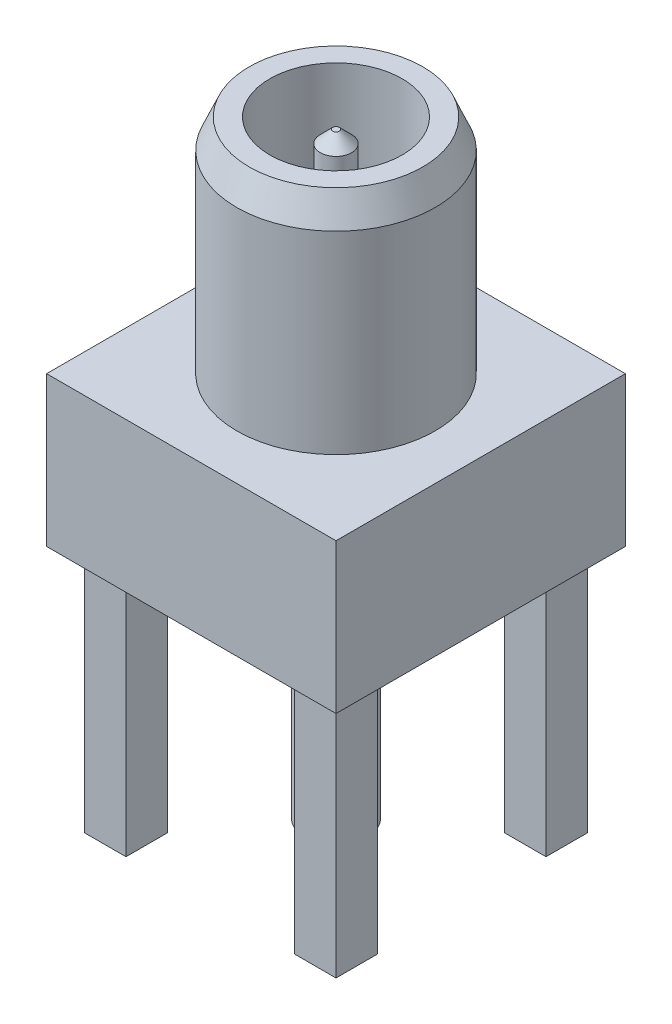
ISO-10303-21;
HEADER;
FILE_DESCRIPTION(('STEP AP214'),'2;1');
FILE_NAME('part.step','',(''),(''),'','','');
FILE_SCHEMA(('AUTOMOTIVE_DESIGN { 1 0 10303 214 1 1 1 1 }'));
ENDSEC;
DATA;
#1=APPLICATION_CONTEXT('core data for automotive mechanical design processes');
#2=APPLICATION_PROTOCOL_DEFINITION('international standard','automotive_design',2000,#1);
#3=PRODUCT_CONTEXT('',#1,'mechanical');
#4=PRODUCT('Part','Part','',(#3));
#5=PRODUCT_RELATED_PRODUCT_CATEGORY('part','',(#4));
#6=PRODUCT_DEFINITION_FORMATION('','',#4);
#7=PRODUCT_DEFINITION_CONTEXT('part definition',#1,'design');
#8=PRODUCT_DEFINITION('design','',#6,#7);
#9=PRODUCT_DEFINITION_SHAPE('','',#8);
#10=(LENGTH_UNIT() NAMED_UNIT(*) SI_UNIT(.MILLI.,.METRE.));
#11=(NAMED_UNIT(*) PLANE_ANGLE_UNIT() SI_UNIT($,.RADIAN.));
#12=(NAMED_UNIT(*) SI_UNIT($,.STERADIAN.) SOLID_ANGLE_UNIT());
#13=UNCERTAINTY_MEASURE_WITH_UNIT(LENGTH_MEASURE(1.E-05),#10,'distance_accuracy_value','');
#14=(GEOMETRIC_REPRESENTATION_CONTEXT(3) GLOBAL_UNCERTAINTY_ASSIGNED_CONTEXT((#13)) GLOBAL_UNIT_ASSIGNED_CONTEXT((#10,
#11,#12)) REPRESENTATION_CONTEXT('',''));
#15=CARTESIAN_POINT('',(0.,0.,0.));
#16=DIRECTION('',(0.,0.,1.));
#17=DIRECTION('',(1.,0.,0.));
#18=AXIS2_PLACEMENT_3D('',#15,#16,#17);
#19=CARTESIAN_POINT('',(0.,0.,0.));
#20=DIRECTION('',(0.,-1.,0.));
#21=DIRECTION('',(0.,0.,-1.));
#22=AXIS2_PLACEMENT_3D('',#19,#20,#21);
#23=PLANE('',#22);
#24=CARTESIAN_POINT('',(0.,0.,0.));
#25=DIRECTION('',(0.,-1.,0.));
#26=DIRECTION('',(0.,0.,1.));
#27=AXIS2_PLACEMENT_3D('',#24,#25,#26);
#28=CIRCLE('',#27,1.);
#29=CARTESIAN_POINT('',(0.,0.,1.));
#30=VERTEX_POINT('',#29);
#31=EDGE_CURVE('E529',#30,#30,#28,.T.);
#32=ORIENTED_EDGE('',*,*,#31,.F.);
#33=EDGE_LOOP('',(#32));
#34=FACE_BOUND('',#33,.T.);
#35=DIRECTION('',(-1.,0.,0.));
#36=VECTOR('',#35,1.);
#37=CARTESIAN_POINT('',(1.75,0.,1.75));
#38=LINE('',#37,#36);
#39=CARTESIAN_POINT('',(1.75,0.,1.75));
#40=VERTEX_POINT('',#39);
#41=CARTESIAN_POINT('',(-1.75,0.,1.75));
#42=VERTEX_POINT('',#41);
#43=EDGE_CURVE('E284',#40,#42,#38,.T.);
#44=ORIENTED_EDGE('',*,*,#43,.T.);
#45=DIRECTION('',(0.,0.,-1.));
#46=VECTOR('',#45,1.);
#47=CARTESIAN_POINT('',(-1.75,0.,1.75));
#48=LINE('',#47,#46);
#49=CARTESIAN_POINT('',(-1.75,0.,-1.75));
#50=VERTEX_POINT('',#49);
#51=EDGE_CURVE('E301',#42,#50,#48,.T.);
#52=ORIENTED_EDGE('',*,*,#51,.T.);
#53=DIRECTION('',(1.,0.,0.));
#54=VECTOR('',#53,1.);
#55=CARTESIAN_POINT('',(-1.75,0.,-1.75));
#56=LINE('',#55,#54);
#57=CARTESIAN_POINT('',(1.75,0.,-1.75));
#58=VERTEX_POINT('',#57);
#59=EDGE_CURVE('E304',#50,#58,#56,.T.);
#60=ORIENTED_EDGE('',*,*,#59,.T.);
#61=DIRECTION('',(0.,0.,1.));
#62=VECTOR('',#61,1.);
#63=CARTESIAN_POINT('',(1.75,0.,-1.75));
#64=LINE('',#63,#62);
#65=EDGE_CURVE('E289',#58,#40,#64,.T.);
#66=ORIENTED_EDGE('',*,*,#65,.T.);
#67=EDGE_LOOP('',(#44,#52,#60,#66));
#68=FACE_BOUND('',#67,.T.);
#69=DIRECTION('',(-1.,0.,0.));
#70=VECTOR('',#69,1.);
#71=CARTESIAN_POINT('',(-1.52,0.,-1.02000000000002));
#72=LINE('',#71,#70);
#73=CARTESIAN_POINT('',(-1.02,0.,-1.02000000000002));
#74=VERTEX_POINT('',#73);
#75=CARTESIAN_POINT('',(-1.52,0.,-1.02000000000002));
#76=VERTEX_POINT('',#75);
#77=EDGE_CURVE('E269',#74,#76,#72,.T.);
#78=ORIENTED_EDGE('',*,*,#77,.F.);
#79=DIRECTION('',(0.,0.,1.));
#80=VECTOR('',#79,1.);
#81=CARTESIAN_POINT('',(-1.02,0.,-1.02000000000002));
#82=LINE('',#81,#80);
#83=CARTESIAN_POINT('',(-1.02,0.,-1.52000000000002));
#84=VERTEX_POINT('',#83);
#85=EDGE_CURVE('E255',#84,#74,#82,.T.);
#86=ORIENTED_EDGE('',*,*,#85,.F.);
#87=DIRECTION('',(1.,0.,0.));
#88=VECTOR('',#87,1.);
#89=CARTESIAN_POINT('',(-1.02,0.,-1.52000000000002));
#90=LINE('',#89,#88);
#91=CARTESIAN_POINT('',(-1.52,0.,-1.52000000000002));
#92=VERTEX_POINT('',#91);
#93=EDGE_CURVE('E260',#92,#84,#90,.T.);
#94=ORIENTED_EDGE('',*,*,#93,.F.);
#95=DIRECTION('',(0.,0.,-1.));
#96=VECTOR('',#95,1.);
#97=CARTESIAN_POINT('',(-1.52,0.,-1.52000000000002));
#98=LINE('',#97,#96);
#99=EDGE_CURVE('E271',#76,#92,#98,.T.);
#100=ORIENTED_EDGE('',*,*,#99,.F.);
#101=EDGE_LOOP('',(#78,#86,#94,#100));
#102=FACE_BOUND('',#101,.T.);
#103=DIRECTION('',(0.,0.,-1.));
#104=VECTOR('',#103,1.);
#105=CARTESIAN_POINT('',(1.02,0.,-1.02000000000002));
#106=LINE('',#105,#104);
#107=CARTESIAN_POINT('',(1.02,0.,-1.02000000000002));
#108=VERTEX_POINT('',#107);
#109=CARTESIAN_POINT('',(1.02,0.,-1.52000000000002));
#110=VERTEX_POINT('',#109);
#111=EDGE_CURVE('E240',#108,#110,#106,.T.);
#112=ORIENTED_EDGE('',*,*,#111,.F.);
#113=DIRECTION('',(-1.,0.,0.));
#114=VECTOR('',#113,1.);
#115=CARTESIAN_POINT('',(1.52,0.,-1.02000000000002));
#116=LINE('',#115,#114);
#117=CARTESIAN_POINT('',(1.52,0.,-1.02000000000002));
#118=VERTEX_POINT('',#117);
#119=EDGE_CURVE('E226',#118,#108,#116,.T.);
#120=ORIENTED_EDGE('',*,*,#119,.F.);
#121=DIRECTION('',(0.,0.,1.));
#122=VECTOR('',#121,1.);
#123=CARTESIAN_POINT('',(1.52,0.,-1.52000000000002));
#124=LINE('',#123,#122);
#125=CARTESIAN_POINT('',(1.52,0.,-1.52000000000002));
#126=VERTEX_POINT('',#125);
#127=EDGE_CURVE('E231',#126,#118,#124,.T.);
#128=ORIENTED_EDGE('',*,*,#127,.F.);
#129=DIRECTION('',(1.,0.,0.));
#130=VECTOR('',#129,1.);
#131=CARTESIAN_POINT('',(1.02,0.,-1.52000000000002));
#132=LINE('',#131,#130);
#133=EDGE_CURVE('E242',#110,#126,#132,.T.);
#134=ORIENTED_EDGE('',*,*,#133,.F.);
#135=EDGE_LOOP('',(#112,#120,#128,#134));
#136=FACE_BOUND('',#135,.T.);
#137=DIRECTION('',(1.,0.,0.));
#138=VECTOR('',#137,1.);
#139=CARTESIAN_POINT('',(1.52,0.,1.02000000000002));
#140=LINE('',#139,#138);
#141=CARTESIAN_POINT('',(1.02,0.,1.02000000000002));
#142=VERTEX_POINT('',#141);
#143=CARTESIAN_POINT('',(1.52,0.,1.02000000000002));
#144=VERTEX_POINT('',#143);
#145=EDGE_CURVE('E198',#142,#144,#140,.T.);
#146=ORIENTED_EDGE('',*,*,#145,.F.);
#147=DIRECTION('',(0.,0.,-1.));
#148=VECTOR('',#147,1.);
#149=CARTESIAN_POINT('',(1.02,0.,1.02000000000002));
#150=LINE('',#149,#148);
#151=CARTESIAN_POINT('',(1.02,0.,1.52000000000002));
#152=VERTEX_POINT('',#151);
#153=EDGE_CURVE('E195',#152,#142,#150,.T.);
#154=ORIENTED_EDGE('',*,*,#153,.F.);
#155=DIRECTION('',(-1.,0.,0.));
#156=VECTOR('',#155,1.);
#157=CARTESIAN_POINT('',(1.02,0.,1.52000000000002));
#158=LINE('',#157,#156);
#159=CARTESIAN_POINT('',(1.52,0.,1.52000000000002));
#160=VERTEX_POINT('',#159);
#161=EDGE_CURVE('E207',#160,#152,#158,.T.);
#162=ORIENTED_EDGE('',*,*,#161,.F.);
#163=DIRECTION('',(0.,0.,1.));
#164=VECTOR('',#163,1.);
#165=CARTESIAN_POINT('',(1.52,0.,1.52000000000002));
#166=LINE('',#165,#164);
#167=EDGE_CURVE('E215',#144,#160,#166,.T.);
#168=ORIENTED_EDGE('',*,*,#167,.F.);
#169=EDGE_LOOP('',(#146,#154,#162,#168));
#170=FACE_BOUND('',#169,.T.);
#171=DIRECTION('',(0.,0.,1.));
#172=VECTOR('',#171,1.);
#173=CARTESIAN_POINT('',(-1.02,0.,1.02000000000002));
#174=LINE('',#173,#172);
#175=CARTESIAN_POINT('',(-1.02,0.,1.02000000000002));
#176=VERTEX_POINT('',#175);
#177=CARTESIAN_POINT('',(-1.02,0.,1.52000000000002));
#178=VERTEX_POINT('',#177);
#179=EDGE_CURVE('E516',#176,#178,#174,.T.);
#180=ORIENTED_EDGE('',*,*,#179,.F.);
#181=DIRECTION('',(1.,0.,0.));
#182=VECTOR('',#181,1.);
#183=CARTESIAN_POINT('',(-1.52,0.,1.02000000000002));
#184=LINE('',#183,#182);
#185=CARTESIAN_POINT('',(-1.52,0.,1.02000000000002));
#186=VERTEX_POINT('',#185);
#187=EDGE_CURVE('E193',#186,#176,#184,.T.);
#188=ORIENTED_EDGE('',*,*,#187,.F.);
#189=DIRECTION('',(0.,0.,-1.));
#190=VECTOR('',#189,1.);
#191=CARTESIAN_POINT('',(-1.52,0.,1.52000000000002));
#192=LINE('',#191,#190);
#193=CARTESIAN_POINT('',(-1.52,0.,1.52000000000002));
#194=VERTEX_POINT('',#193);
#195=EDGE_CURVE('E189',#194,#186,#192,.T.);
#196=ORIENTED_EDGE('',*,*,#195,.F.);
#197=DIRECTION('',(-1.,0.,0.));
#198=VECTOR('',#197,1.);
#199=CARTESIAN_POINT('',(-1.02,0.,1.52000000000002));
#200=LINE('',#199,#198);
#201=EDGE_CURVE('E518',#178,#194,#200,.T.);
#202=ORIENTED_EDGE('',*,*,#201,.F.);
#203=EDGE_LOOP('',(#180,#188,#196,#202));
#204=FACE_BOUND('',#203,.T.);
#205=ADVANCED_FACE('F32',(#34,#68,#102,#136,#170,#204),#23,.T.);
#206=CARTESIAN_POINT('',(1.75,1.81000000000001,1.75));
#207=DIRECTION('',(0.,0.,1.));
#208=DIRECTION('',(1.,0.,0.));
#209=AXIS2_PLACEMENT_3D('',#206,#207,#208);
#210=PLANE('',#209);
#211=ORIENTED_EDGE('',*,*,#43,.F.);
#212=DIRECTION('',(0.,-1.,0.));
#213=VECTOR('',#212,1.);
#214=CARTESIAN_POINT('',(1.75,1.81000000000001,1.75));
#215=LINE('',#214,#213);
#216=CARTESIAN_POINT('',(1.75,1.81000000000001,1.75));
#217=VERTEX_POINT('',#216);
#218=EDGE_CURVE('E309',#217,#40,#215,.T.);
#219=ORIENTED_EDGE('',*,*,#218,.F.);
#220=DIRECTION('',(-1.,0.,0.));
#221=VECTOR('',#220,1.);
#222=CARTESIAN_POINT('',(1.75,1.81000000000001,1.75));
#223=LINE('',#222,#221);
#224=CARTESIAN_POINT('',(-1.75,1.81000000000001,1.75));
#225=VERTEX_POINT('',#224);
#226=EDGE_CURVE('E285',#217,#225,#223,.T.);
#227=ORIENTED_EDGE('',*,*,#226,.T.);
#228=DIRECTION('',(0.,-1.,0.));
#229=VECTOR('',#228,1.);
#230=CARTESIAN_POINT('',(-1.75,1.81000000000001,1.75));
#231=LINE('',#230,#229);
#232=EDGE_CURVE('E298',#225,#42,#231,.T.);
#233=ORIENTED_EDGE('',*,*,#232,.T.);
#234=EDGE_LOOP('',(#211,#219,#227,#233));
#235=FACE_BOUND('',#234,.T.);
#236=ADVANCED_FACE('F349',(#235),#210,.T.);
#237=CARTESIAN_POINT('',(1.75,1.81000000000001,-1.75));
#238=DIRECTION('',(1.,0.,0.));
#239=DIRECTION('',(0.,0.,-1.));
#240=AXIS2_PLACEMENT_3D('',#237,#238,#239);
#241=PLANE('',#240);
#242=ORIENTED_EDGE('',*,*,#65,.F.);
#243=DIRECTION('',(0.,-1.,0.));
#244=VECTOR('',#243,1.);
#245=CARTESIAN_POINT('',(1.75,1.81000000000001,-1.75));
#246=LINE('',#245,#244);
#247=CARTESIAN_POINT('',(1.75,1.81000000000001,-1.75));
#248=VERTEX_POINT('',#247);
#249=EDGE_CURVE('E312',#248,#58,#246,.T.);
#250=ORIENTED_EDGE('',*,*,#249,.F.);
#251=DIRECTION('',(0.,0.,1.));
#252=VECTOR('',#251,1.);
#253=CARTESIAN_POINT('',(1.75,1.81000000000001,-1.75));
#254=LINE('',#253,#252);
#255=EDGE_CURVE('E295',#248,#217,#254,.T.);
#256=ORIENTED_EDGE('',*,*,#255,.T.);
#257=ORIENTED_EDGE('',*,*,#218,.T.);
#258=EDGE_LOOP('',(#242,#250,#256,#257));
#259=FACE_BOUND('',#258,.T.);
#260=ADVANCED_FACE('F355',(#259),#241,.T.);
#261=CARTESIAN_POINT('',(-1.75,1.81000000000001,-1.75));
#262=DIRECTION('',(0.,0.,-1.));
#263=DIRECTION('',(-1.,0.,0.));
#264=AXIS2_PLACEMENT_3D('',#261,#262,#263);
#265=PLANE('',#264);
#266=ORIENTED_EDGE('',*,*,#59,.F.);
#267=DIRECTION('',(0.,-1.,0.));
#268=VECTOR('',#267,1.);
#269=CARTESIAN_POINT('',(-1.75,1.81000000000001,-1.75));
#270=LINE('',#269,#268);
#271=CARTESIAN_POINT('',(-1.75,1.81000000000001,-1.75));
#272=VERTEX_POINT('',#271);
#273=EDGE_CURVE('E314',#272,#50,#270,.T.);
#274=ORIENTED_EDGE('',*,*,#273,.F.);
#275=DIRECTION('',(1.,0.,0.));
#276=VECTOR('',#275,1.);
#277=CARTESIAN_POINT('',(-1.75,1.81000000000001,-1.75));
#278=LINE('',#277,#276);
#279=EDGE_CURVE('E292',#272,#248,#278,.T.);
#280=ORIENTED_EDGE('',*,*,#279,.T.);
#281=ORIENTED_EDGE('',*,*,#249,.T.);
#282=EDGE_LOOP('',(#266,#274,#280,#281));
#283=FACE_BOUND('',#282,.T.);
#284=ADVANCED_FACE('F366',(#283),#265,.T.);
#285=CARTESIAN_POINT('',(-1.75,1.81000000000001,1.75));
#286=DIRECTION('',(-1.,0.,0.));
#287=DIRECTION('',(0.,0.,1.));
#288=AXIS2_PLACEMENT_3D('',#285,#286,#287);
#289=PLANE('',#288);
#290=ORIENTED_EDGE('',*,*,#51,.F.);
#291=ORIENTED_EDGE('',*,*,#232,.F.);
#292=DIRECTION('',(0.,0.,-1.));
#293=VECTOR('',#292,1.);
#294=CARTESIAN_POINT('',(-1.75,1.81000000000001,1.75));
#295=LINE('',#294,#293);
#296=EDGE_CURVE('E288',#225,#272,#295,.T.);
#297=ORIENTED_EDGE('',*,*,#296,.T.);
#298=ORIENTED_EDGE('',*,*,#273,.T.);
#299=EDGE_LOOP('',(#290,#291,#297,#298));
#300=FACE_BOUND('',#299,.T.);
#301=ADVANCED_FACE('F370',(#300),#289,.T.);
#302=CARTESIAN_POINT('',(0.,1.81000000000001,0.));
#303=DIRECTION('',(0.,-1.,0.));
#304=DIRECTION('',(0.,0.,-1.));
#305=AXIS2_PLACEMENT_3D('',#302,#303,#304);
#306=PLANE('',#305);
#307=CARTESIAN_POINT('',(0.,1.81000000000001,0.));
#308=DIRECTION('',(0.,-1.,0.));
#309=DIRECTION('',(0.,0.,-1.));
#310=AXIS2_PLACEMENT_3D('',#307,#308,#309);
#311=CIRCLE('',#310,1.2);
#312=CARTESIAN_POINT('',(0.,1.81000000000001,-1.2));
#313=VERTEX_POINT('',#312);
#314=EDGE_CURVE('E311',#313,#313,#311,.F.);
#315=ORIENTED_EDGE('',*,*,#314,.F.);
#316=EDGE_LOOP('',(#315));
#317=FACE_BOUND('',#316,.T.);
#318=ORIENTED_EDGE('',*,*,#226,.F.);
#319=ORIENTED_EDGE('',*,*,#255,.F.);
#320=ORIENTED_EDGE('',*,*,#279,.F.);
#321=ORIENTED_EDGE('',*,*,#296,.F.);
#322=EDGE_LOOP('',(#318,#319,#320,#321));
#323=FACE_BOUND('',#322,.T.);
#324=ADVANCED_FACE('F362',(#317,#323),#306,.F.);
#325=CARTESIAN_POINT('',(-1.02,-3.,-1.02000000000002));
#326=DIRECTION('',(-1.,0.,0.));
#327=DIRECTION('',(0.,0.,1.));
#328=AXIS2_PLACEMENT_3D('',#325,#326,#327);
#329=PLANE('',#328);
#330=ORIENTED_EDGE('',*,*,#85,.T.);
#331=DIRECTION('',(0.,1.,0.));
#332=VECTOR('',#331,1.);
#333=CARTESIAN_POINT('',(-1.02,-3.,-1.02000000000002));
#334=LINE('',#333,#332);
#335=CARTESIAN_POINT('',(-1.02,-3.,-1.02000000000002));
#336=VERTEX_POINT('',#335);
#337=EDGE_CURVE('E282',#336,#74,#334,.T.);
#338=ORIENTED_EDGE('',*,*,#337,.F.);
#339=DIRECTION('',(0.,0.,1.));
#340=VECTOR('',#339,1.);
#341=CARTESIAN_POINT('',(-1.02,-3.,-1.02000000000002));
#342=LINE('',#341,#340);
#343=CARTESIAN_POINT('',(-1.02,-3.,-1.52000000000002));
#344=VERTEX_POINT('',#343);
#345=EDGE_CURVE('E256',#344,#336,#342,.T.);
#346=ORIENTED_EDGE('',*,*,#345,.F.);
#347=DIRECTION('',(0.,1.,0.));
#348=VECTOR('',#347,1.);
#349=CARTESIAN_POINT('',(-1.02,-3.,-1.52000000000002));
#350=LINE('',#349,#348);
#351=EDGE_CURVE('E266',#344,#84,#350,.T.);
#352=ORIENTED_EDGE('',*,*,#351,.T.);
#353=EDGE_LOOP('',(#330,#338,#346,#352));
#354=FACE_BOUND('',#353,.T.);
#355=ADVANCED_FACE('F486',(#354),#329,.F.);
#356=CARTESIAN_POINT('',(-1.52,-3.,-1.02000000000002));
#357=DIRECTION('',(0.,0.,-1.));
#358=DIRECTION('',(0.,1.,0.));
#359=AXIS2_PLACEMENT_3D('',#356,#357,#358);
#360=PLANE('',#359);
#361=ORIENTED_EDGE('',*,*,#77,.T.);
#362=DIRECTION('',(0.,1.,0.));
#363=VECTOR('',#362,1.);
#364=CARTESIAN_POINT('',(-1.52,-3.,-1.02000000000002));
#365=LINE('',#364,#363);
#366=CARTESIAN_POINT('',(-1.52,-3.,-1.02000000000002));
#367=VERTEX_POINT('',#366);
#368=EDGE_CURVE('E279',#367,#76,#365,.T.);
#369=ORIENTED_EDGE('',*,*,#368,.F.);
#370=DIRECTION('',(-1.,0.,0.));
#371=VECTOR('',#370,1.);
#372=CARTESIAN_POINT('',(-1.52,-3.,-1.02000000000002));
#373=LINE('',#372,#371);
#374=EDGE_CURVE('E259',#336,#367,#373,.T.);
#375=ORIENTED_EDGE('',*,*,#374,.F.);
#376=ORIENTED_EDGE('',*,*,#337,.T.);
#377=EDGE_LOOP('',(#361,#369,#375,#376));
#378=FACE_BOUND('',#377,.T.);
#379=ADVANCED_FACE('F483',(#378),#360,.F.);
#380=CARTESIAN_POINT('',(-1.52,-3.,-1.52000000000002));
#381=DIRECTION('',(1.,0.,0.));
#382=DIRECTION('',(0.,1.,0.));
#383=AXIS2_PLACEMENT_3D('',#380,#381,#382);
#384=PLANE('',#383);
#385=ORIENTED_EDGE('',*,*,#99,.T.);
#386=DIRECTION('',(0.,1.,0.));
#387=VECTOR('',#386,1.);
#388=CARTESIAN_POINT('',(-1.52,-3.,-1.52000000000002));
#389=LINE('',#388,#387);
#390=CARTESIAN_POINT('',(-1.52,-3.,-1.52000000000002));
#391=VERTEX_POINT('',#390);
#392=EDGE_CURVE('E277',#391,#92,#389,.T.);
#393=ORIENTED_EDGE('',*,*,#392,.F.);
#394=DIRECTION('',(0.,0.,-1.));
#395=VECTOR('',#394,1.);
#396=CARTESIAN_POINT('',(-1.52,-3.,-1.52000000000002));
#397=LINE('',#396,#395);
#398=EDGE_CURVE('E262',#367,#391,#397,.T.);
#399=ORIENTED_EDGE('',*,*,#398,.F.);
#400=ORIENTED_EDGE('',*,*,#368,.T.);
#401=EDGE_LOOP('',(#385,#393,#399,#400));
#402=FACE_BOUND('',#401,.T.);
#403=ADVANCED_FACE('F479',(#402),#384,.F.);
#404=CARTESIAN_POINT('',(-1.02,-3.,-1.52000000000002));
#405=DIRECTION('',(0.,0.,1.));
#406=DIRECTION('',(0.,-1.,0.));
#407=AXIS2_PLACEMENT_3D('',#404,#405,#406);
#408=PLANE('',#407);
#409=ORIENTED_EDGE('',*,*,#93,.T.);
#410=ORIENTED_EDGE('',*,*,#351,.F.);
#411=DIRECTION('',(1.,0.,0.));
#412=VECTOR('',#411,1.);
#413=CARTESIAN_POINT('',(-1.02,-3.,-1.52000000000002));
#414=LINE('',#413,#412);
#415=EDGE_CURVE('E264',#391,#344,#414,.T.);
#416=ORIENTED_EDGE('',*,*,#415,.F.);
#417=ORIENTED_EDGE('',*,*,#392,.T.);
#418=EDGE_LOOP('',(#409,#410,#416,#417));
#419=FACE_BOUND('',#418,.T.);
#420=ADVANCED_FACE('F475',(#419),#408,.F.);
#421=CARTESIAN_POINT('',(0.,-3.,0.));
#422=DIRECTION('',(0.,1.,0.));
#423=DIRECTION('',(0.,0.,1.));
#424=AXIS2_PLACEMENT_3D('',#421,#422,#423);
#425=PLANE('',#424);
#426=ORIENTED_EDGE('',*,*,#345,.T.);
#427=ORIENTED_EDGE('',*,*,#374,.T.);
#428=ORIENTED_EDGE('',*,*,#398,.T.);
#429=ORIENTED_EDGE('',*,*,#415,.T.);
#430=EDGE_LOOP('',(#426,#427,#428,#429));
#431=FACE_BOUND('',#430,.T.);
#432=ADVANCED_FACE('F471',(#431),#425,.F.);
#433=CARTESIAN_POINT('',(1.52,-3.,-1.02000000000002));
#434=DIRECTION('',(0.,0.,-1.));
#435=DIRECTION('',(0.,1.,0.));
#436=AXIS2_PLACEMENT_3D('',#433,#434,#435);
#437=PLANE('',#436);
#438=ORIENTED_EDGE('',*,*,#119,.T.);
#439=DIRECTION('',(0.,1.,0.));
#440=VECTOR('',#439,1.);
#441=CARTESIAN_POINT('',(1.02,-3.,-1.02000000000002));
#442=LINE('',#441,#440);
#443=CARTESIAN_POINT('',(1.02,-3.,-1.02000000000002));
#444=VERTEX_POINT('',#443);
#445=EDGE_CURVE('E253',#444,#108,#442,.T.);
#446=ORIENTED_EDGE('',*,*,#445,.F.);
#447=DIRECTION('',(-1.,0.,0.));
#448=VECTOR('',#447,1.);
#449=CARTESIAN_POINT('',(1.52,-3.,-1.02000000000002));
#450=LINE('',#449,#448);
#451=CARTESIAN_POINT('',(1.52,-3.,-1.02000000000002));
#452=VERTEX_POINT('',#451);
#453=EDGE_CURVE('E227',#452,#444,#450,.T.);
#454=ORIENTED_EDGE('',*,*,#453,.F.);
#455=DIRECTION('',(0.,1.,0.));
#456=VECTOR('',#455,1.);
#457=CARTESIAN_POINT('',(1.52,-3.,-1.02000000000002));
#458=LINE('',#457,#456);
#459=EDGE_CURVE('E237',#452,#118,#458,.T.);
#460=ORIENTED_EDGE('',*,*,#459,.T.);
#461=EDGE_LOOP('',(#438,#446,#454,#460));
#462=FACE_BOUND('',#461,.T.);
#463=ADVANCED_FACE('F467',(#462),#437,.F.);
#464=CARTESIAN_POINT('',(1.02,-3.,-1.02000000000002));
#465=DIRECTION('',(1.,0.,0.));
#466=DIRECTION('',(0.,0.,-1.));
#467=AXIS2_PLACEMENT_3D('',#464,#465,#466);
#468=PLANE('',#467);
#469=ORIENTED_EDGE('',*,*,#111,.T.);
#470=DIRECTION('',(0.,1.,0.));
#471=VECTOR('',#470,1.);
#472=CARTESIAN_POINT('',(1.02,-3.,-1.52000000000002));
#473=LINE('',#472,#471);
#474=CARTESIAN_POINT('',(1.02,-3.,-1.52000000000002));
#475=VERTEX_POINT('',#474);
#476=EDGE_CURVE('E250',#475,#110,#473,.T.);
#477=ORIENTED_EDGE('',*,*,#476,.F.);
#478=DIRECTION('',(0.,0.,-1.));
#479=VECTOR('',#478,1.);
#480=CARTESIAN_POINT('',(1.02,-3.,-1.02000000000002));
#481=LINE('',#480,#479);
#482=EDGE_CURVE('E230',#444,#475,#481,.T.);
#483=ORIENTED_EDGE('',*,*,#482,.F.);
#484=ORIENTED_EDGE('',*,*,#445,.T.);
#485=EDGE_LOOP('',(#469,#477,#483,#484));
#486=FACE_BOUND('',#485,.T.);
#487=ADVANCED_FACE('F463',(#486),#468,.F.);
#488=CARTESIAN_POINT('',(1.02,-3.,-1.52000000000002));
#489=DIRECTION('',(0.,0.,1.));
#490=DIRECTION('',(0.,-1.,0.));
#491=AXIS2_PLACEMENT_3D('',#488,#489,#490);
#492=PLANE('',#491);
#493=ORIENTED_EDGE('',*,*,#133,.T.);
#494=DIRECTION('',(0.,1.,0.));
#495=VECTOR('',#494,1.);
#496=CARTESIAN_POINT('',(1.52,-3.,-1.52000000000002));
#497=LINE('',#496,#495);
#498=CARTESIAN_POINT('',(1.52,-3.,-1.52000000000002));
#499=VERTEX_POINT('',#498);
#500=EDGE_CURVE('E248',#499,#126,#497,.T.);
#501=ORIENTED_EDGE('',*,*,#500,.F.);
#502=DIRECTION('',(1.,0.,0.));
#503=VECTOR('',#502,1.);
#504=CARTESIAN_POINT('',(1.02,-3.,-1.52000000000002));
#505=LINE('',#504,#503);
#506=EDGE_CURVE('E233',#475,#499,#505,.T.);
#507=ORIENTED_EDGE('',*,*,#506,.F.);
#508=ORIENTED_EDGE('',*,*,#476,.T.);
#509=EDGE_LOOP('',(#493,#501,#507,#508));
#510=FACE_BOUND('',#509,.T.);
#511=ADVANCED_FACE('F459',(#510),#492,.F.);
#512=CARTESIAN_POINT('',(1.52,-3.,-1.52000000000002));
#513=DIRECTION('',(-1.,0.,0.));
#514=DIRECTION('',(0.,-1.,0.));
#515=AXIS2_PLACEMENT_3D('',#512,#513,#514);
#516=PLANE('',#515);
#517=ORIENTED_EDGE('',*,*,#127,.T.);
#518=ORIENTED_EDGE('',*,*,#459,.F.);
#519=DIRECTION('',(0.,0.,1.));
#520=VECTOR('',#519,1.);
#521=CARTESIAN_POINT('',(1.52,-3.,-1.52000000000002));
#522=LINE('',#521,#520);
#523=EDGE_CURVE('E235',#499,#452,#522,.T.);
#524=ORIENTED_EDGE('',*,*,#523,.F.);
#525=ORIENTED_EDGE('',*,*,#500,.T.);
#526=EDGE_LOOP('',(#517,#518,#524,#525));
#527=FACE_BOUND('',#526,.T.);
#528=ADVANCED_FACE('F455',(#527),#516,.F.);
#529=CARTESIAN_POINT('',(0.,-3.,0.));
#530=DIRECTION('',(0.,-1.,0.));
#531=DIRECTION('',(0.,0.,-1.));
#532=AXIS2_PLACEMENT_3D('',#529,#530,#531);
#533=PLANE('',#532);
#534=ORIENTED_EDGE('',*,*,#453,.T.);
#535=ORIENTED_EDGE('',*,*,#482,.T.);
#536=ORIENTED_EDGE('',*,*,#506,.T.);
#537=ORIENTED_EDGE('',*,*,#523,.T.);
#538=EDGE_LOOP('',(#534,#535,#536,#537));
#539=FACE_BOUND('',#538,.T.);
#540=ADVANCED_FACE('F451',(#539),#533,.T.);
#541=CARTESIAN_POINT('',(1.02,-3.,1.02000000000002));
#542=DIRECTION('',(1.,0.,0.));
#543=DIRECTION('',(0.,0.,-1.));
#544=AXIS2_PLACEMENT_3D('',#541,#542,#543);
#545=PLANE('',#544);
#546=ORIENTED_EDGE('',*,*,#153,.T.);
#547=DIRECTION('',(0.,1.,0.));
#548=VECTOR('',#547,1.);
#549=CARTESIAN_POINT('',(1.02,-3.,1.02000000000002));
#550=LINE('',#549,#548);
#551=CARTESIAN_POINT('',(1.02,-3.,1.02000000000002));
#552=VERTEX_POINT('',#551);
#553=EDGE_CURVE('E224',#552,#142,#550,.T.);
#554=ORIENTED_EDGE('',*,*,#553,.F.);
#555=DIRECTION('',(0.,0.,-1.));
#556=VECTOR('',#555,1.);
#557=CARTESIAN_POINT('',(1.02,-3.,1.02000000000002));
#558=LINE('',#557,#556);
#559=CARTESIAN_POINT('',(1.02,-3.,1.52000000000002));
#560=VERTEX_POINT('',#559);
#561=EDGE_CURVE('E203',#560,#552,#558,.T.);
#562=ORIENTED_EDGE('',*,*,#561,.F.);
#563=DIRECTION('',(0.,1.,0.));
#564=VECTOR('',#563,1.);
#565=CARTESIAN_POINT('',(1.02,-3.,1.52000000000002));
#566=LINE('',#565,#564);
#567=EDGE_CURVE('E212',#560,#152,#566,.T.);
#568=ORIENTED_EDGE('',*,*,#567,.T.);
#569=EDGE_LOOP('',(#546,#554,#562,#568));
#570=FACE_BOUND('',#569,.T.);
#571=ADVANCED_FACE('F447',(#570),#545,.F.);
#572=CARTESIAN_POINT('',(1.52,-3.,1.02000000000002));
#573=DIRECTION('',(0.,0.,1.));
#574=DIRECTION('',(0.,-1.,0.));
#575=AXIS2_PLACEMENT_3D('',#572,#573,#574);
#576=PLANE('',#575);
#577=ORIENTED_EDGE('',*,*,#145,.T.);
#578=DIRECTION('',(0.,1.,0.));
#579=VECTOR('',#578,1.);
#580=CARTESIAN_POINT('',(1.52,-3.,1.02000000000002));
#581=LINE('',#580,#579);
#582=CARTESIAN_POINT('',(1.52,-3.,1.02000000000002));
#583=VERTEX_POINT('',#582);
#584=EDGE_CURVE('E221',#583,#144,#581,.T.);
#585=ORIENTED_EDGE('',*,*,#584,.F.);
#586=DIRECTION('',(1.,0.,0.));
#587=VECTOR('',#586,1.);
#588=CARTESIAN_POINT('',(1.52,-3.,1.02000000000002));
#589=LINE('',#588,#587);
#590=EDGE_CURVE('E206',#552,#583,#589,.T.);
#591=ORIENTED_EDGE('',*,*,#590,.F.);
#592=ORIENTED_EDGE('',*,*,#553,.T.);
#593=EDGE_LOOP('',(#577,#585,#591,#592));
#594=FACE_BOUND('',#593,.T.);
#595=ADVANCED_FACE('F443',(#594),#576,.F.);
#596=CARTESIAN_POINT('',(1.52,-3.,1.52000000000002));
#597=DIRECTION('',(-1.,0.,0.));
#598=DIRECTION('',(0.,-1.,0.));
#599=AXIS2_PLACEMENT_3D('',#596,#597,#598);
#600=PLANE('',#599);
#601=ORIENTED_EDGE('',*,*,#167,.T.);
#602=DIRECTION('',(0.,1.,0.));
#603=VECTOR('',#602,1.);
#604=CARTESIAN_POINT('',(1.52,-3.,1.52000000000002));
#605=LINE('',#604,#603);
#606=CARTESIAN_POINT('',(1.52,-3.,1.52000000000002));
#607=VERTEX_POINT('',#606);
#608=EDGE_CURVE('E55',#607,#160,#605,.T.);
#609=ORIENTED_EDGE('',*,*,#608,.F.);
#610=DIRECTION('',(0.,0.,1.));
#611=VECTOR('',#610,1.);
#612=CARTESIAN_POINT('',(1.52,-3.,1.52000000000002));
#613=LINE('',#612,#611);
#614=EDGE_CURVE('E209',#583,#607,#613,.T.);
#615=ORIENTED_EDGE('',*,*,#614,.F.);
#616=ORIENTED_EDGE('',*,*,#584,.T.);
#617=EDGE_LOOP('',(#601,#609,#615,#616));
#618=FACE_BOUND('',#617,.T.);
#619=ADVANCED_FACE('F440',(#618),#600,.F.);
#620=CARTESIAN_POINT('',(1.02,-3.,1.52000000000002));
#621=DIRECTION('',(0.,0.,-1.));
#622=DIRECTION('',(0.,1.,0.));
#623=AXIS2_PLACEMENT_3D('',#620,#621,#622);
#624=PLANE('',#623);
#625=ORIENTED_EDGE('',*,*,#161,.T.);
#626=ORIENTED_EDGE('',*,*,#567,.F.);
#627=DIRECTION('',(-1.,0.,0.));
#628=VECTOR('',#627,1.);
#629=CARTESIAN_POINT('',(1.02,-3.,1.52000000000002));
#630=LINE('',#629,#628);
#631=EDGE_CURVE('E211',#607,#560,#630,.T.);
#632=ORIENTED_EDGE('',*,*,#631,.F.);
#633=ORIENTED_EDGE('',*,*,#608,.T.);
#634=EDGE_LOOP('',(#625,#626,#632,#633));
#635=FACE_BOUND('',#634,.T.);
#636=ADVANCED_FACE('F436',(#635),#624,.F.);
#637=CARTESIAN_POINT('',(0.,-3.,0.));
#638=DIRECTION('',(0.,1.,0.));
#639=DIRECTION('',(0.,0.,1.));
#640=AXIS2_PLACEMENT_3D('',#637,#638,#639);
#641=PLANE('',#640);
#642=ORIENTED_EDGE('',*,*,#561,.T.);
#643=ORIENTED_EDGE('',*,*,#590,.T.);
#644=ORIENTED_EDGE('',*,*,#614,.T.);
#645=ORIENTED_EDGE('',*,*,#631,.T.);
#646=EDGE_LOOP('',(#642,#643,#644,#645));
#647=FACE_BOUND('',#646,.T.);
#648=ADVANCED_FACE('F433',(#647),#641,.F.);
#649=CARTESIAN_POINT('',(-1.52,-3.,1.02000000000002));
#650=DIRECTION('',(0.,0.,1.));
#651=DIRECTION('',(0.,-1.,0.));
#652=AXIS2_PLACEMENT_3D('',#649,#650,#651);
#653=PLANE('',#652);
#654=ORIENTED_EDGE('',*,*,#187,.T.);
#655=DIRECTION('',(0.,1.,0.));
#656=VECTOR('',#655,1.);
#657=CARTESIAN_POINT('',(-1.02,-3.,1.02000000000002));
#658=LINE('',#657,#656);
#659=CARTESIAN_POINT('',(-1.02,-3.,1.02000000000002));
#660=VERTEX_POINT('',#659);
#661=EDGE_CURVE('E174',#660,#176,#658,.T.);
#662=ORIENTED_EDGE('',*,*,#661,.F.);
#663=DIRECTION('',(1.,0.,0.));
#664=VECTOR('',#663,1.);
#665=CARTESIAN_POINT('',(-1.52,-3.,1.02000000000002));
#666=LINE('',#665,#664);
#667=CARTESIAN_POINT('',(-1.52,-3.,1.02000000000002));
#668=VERTEX_POINT('',#667);
#669=EDGE_CURVE('E181',#668,#660,#666,.T.);
#670=ORIENTED_EDGE('',*,*,#669,.F.);
#671=DIRECTION('',(0.,1.,0.));
#672=VECTOR('',#671,1.);
#673=CARTESIAN_POINT('',(-1.52,-3.,1.02000000000002));
#674=LINE('',#673,#672);
#675=EDGE_CURVE('E526',#668,#186,#674,.T.);
#676=ORIENTED_EDGE('',*,*,#675,.T.);
#677=EDGE_LOOP('',(#654,#662,#670,#676));
#678=FACE_BOUND('',#677,.T.);
#679=ADVANCED_FACE('F191',(#678),#653,.F.);
#680=CARTESIAN_POINT('',(-1.02,-3.,1.02000000000002));
#681=DIRECTION('',(-1.,0.,0.));
#682=DIRECTION('',(0.,0.,1.));
#683=AXIS2_PLACEMENT_3D('',#680,#681,#682);
#684=PLANE('',#683);
#685=ORIENTED_EDGE('',*,*,#179,.T.);
#686=DIRECTION('',(0.,1.,0.));
#687=VECTOR('',#686,1.);
#688=CARTESIAN_POINT('',(-1.02,-3.,1.52000000000002));
#689=LINE('',#688,#687);
#690=CARTESIAN_POINT('',(-1.02,-3.,1.52000000000002));
#691=VERTEX_POINT('',#690);
#692=EDGE_CURVE('E177',#691,#178,#689,.T.);
#693=ORIENTED_EDGE('',*,*,#692,.F.);
#694=DIRECTION('',(0.,0.,1.));
#695=VECTOR('',#694,1.);
#696=CARTESIAN_POINT('',(-1.02,-3.,1.02000000000002));
#697=LINE('',#696,#695);
#698=EDGE_CURVE('E170',#660,#691,#697,.T.);
#699=ORIENTED_EDGE('',*,*,#698,.F.);
#700=ORIENTED_EDGE('',*,*,#661,.T.);
#701=EDGE_LOOP('',(#685,#693,#699,#700));
#702=FACE_BOUND('',#701,.T.);
#703=ADVANCED_FACE('F172',(#702),#684,.F.);
#704=CARTESIAN_POINT('',(-1.02,-3.,1.52000000000002));
#705=DIRECTION('',(0.,0.,-1.));
#706=DIRECTION('',(0.,1.,0.));
#707=AXIS2_PLACEMENT_3D('',#704,#705,#706);
#708=PLANE('',#707);
#709=ORIENTED_EDGE('',*,*,#201,.T.);
#710=DIRECTION('',(0.,1.,0.));
#711=VECTOR('',#710,1.);
#712=CARTESIAN_POINT('',(-1.52,-3.,1.52000000000002));
#713=LINE('',#712,#711);
#714=CARTESIAN_POINT('',(-1.52,-3.,1.52000000000002));
#715=VERTEX_POINT('',#714);
#716=EDGE_CURVE('E47',#715,#194,#713,.T.);
#717=ORIENTED_EDGE('',*,*,#716,.F.);
#718=DIRECTION('',(-1.,0.,0.));
#719=VECTOR('',#718,1.);
#720=CARTESIAN_POINT('',(-1.02,-3.,1.52000000000002));
#721=LINE('',#720,#719);
#722=EDGE_CURVE('E180',#691,#715,#721,.T.);
#723=ORIENTED_EDGE('',*,*,#722,.F.);
#724=ORIENTED_EDGE('',*,*,#692,.T.);
#725=EDGE_LOOP('',(#709,#717,#723,#724));
#726=FACE_BOUND('',#725,.T.);
#727=ADVANCED_FACE('F425',(#726),#708,.F.);
#728=CARTESIAN_POINT('',(-1.52,-3.,1.52000000000002));
#729=DIRECTION('',(1.,0.,0.));
#730=DIRECTION('',(0.,1.,0.));
#731=AXIS2_PLACEMENT_3D('',#728,#729,#730);
#732=PLANE('',#731);
#733=ORIENTED_EDGE('',*,*,#195,.T.);
#734=ORIENTED_EDGE('',*,*,#675,.F.);
#735=DIRECTION('',(0.,0.,-1.));
#736=VECTOR('',#735,1.);
#737=CARTESIAN_POINT('',(-1.52,-3.,1.52000000000002));
#738=LINE('',#737,#736);
#739=EDGE_CURVE('E185',#715,#668,#738,.T.);
#740=ORIENTED_EDGE('',*,*,#739,.F.);
#741=ORIENTED_EDGE('',*,*,#716,.T.);
#742=EDGE_LOOP('',(#733,#734,#740,#741));
#743=FACE_BOUND('',#742,.T.);
#744=ADVANCED_FACE('F422',(#743),#732,.F.);
#745=CARTESIAN_POINT('',(0.,-3.,0.));
#746=DIRECTION('',(0.,-1.,0.));
#747=DIRECTION('',(0.,0.,-1.));
#748=AXIS2_PLACEMENT_3D('',#745,#746,#747);
#749=PLANE('',#748);
#750=ORIENTED_EDGE('',*,*,#669,.T.);
#751=ORIENTED_EDGE('',*,*,#698,.T.);
#752=ORIENTED_EDGE('',*,*,#722,.T.);
#753=ORIENTED_EDGE('',*,*,#739,.T.);
#754=EDGE_LOOP('',(#750,#751,#752,#753));
#755=FACE_BOUND('',#754,.T.);
#756=ADVANCED_FACE('F184',(#755),#749,.T.);
#757=CARTESIAN_POINT('',(0.,0.001,0.));
#758=DIRECTION('',(0.,-1.,0.));
#759=DIRECTION('',(0.,0.,-1.));
#760=AXIS2_PLACEMENT_3D('',#757,#758,#759);
#761=CYLINDRICAL_SURFACE('',#760,1.);
#762=CARTESIAN_POINT('',(0.,0.001,0.));
#763=DIRECTION('',(0.,-1.,0.));
#764=DIRECTION('',(0.,0.,1.));
#765=AXIS2_PLACEMENT_3D('',#762,#763,#764);
#766=CIRCLE('',#765,1.);
#767=CARTESIAN_POINT('',(0.,0.001,1.));
#768=VERTEX_POINT('',#767);
#769=EDGE_CURVE('E521',#768,#768,#766,.T.);
#770=ORIENTED_EDGE('',*,*,#769,.F.);
#771=EDGE_LOOP('',(#770));
#772=FACE_BOUND('',#771,.T.);
#773=ORIENTED_EDGE('',*,*,#31,.T.);
#774=EDGE_LOOP('',(#773));
#775=FACE_BOUND('',#774,.T.);
#776=ADVANCED_FACE('F415',(#772,#775),#761,.F.);
#777=CARTESIAN_POINT('',(0.,0.001,0.));
#778=DIRECTION('',(0.,1.,0.));
#779=DIRECTION('',(0.,0.,1.));
#780=AXIS2_PLACEMENT_3D('',#777,#778,#779);
#781=PLANE('',#780);
#782=CARTESIAN_POINT('',(0.,0.00100000000000013,0.));
#783=DIRECTION('',(0.,1.,0.));
#784=DIRECTION('',(0.,0.,1.));
#785=AXIS2_PLACEMENT_3D('',#782,#783,#784);
#786=CIRCLE('',#785,0.381);
#787=CARTESIAN_POINT('',(0.,0.00100000000000013,0.381));
#788=VERTEX_POINT('',#787);
#789=EDGE_CURVE('E325',#788,#788,#786,.F.);
#790=ORIENTED_EDGE('',*,*,#789,.F.);
#791=EDGE_LOOP('',(#790));
#792=FACE_BOUND('',#791,.T.);
#793=ORIENTED_EDGE('',*,*,#769,.T.);
#794=EDGE_LOOP('',(#793));
#795=FACE_BOUND('',#794,.T.);
#796=ADVANCED_FACE('F411',(#792,#795),#781,.F.);
#797=CARTESIAN_POINT('',(0.,4.50000000000001,0.));
#798=DIRECTION('',(0.,-1.,0.));
#799=DIRECTION('',(0.,0.,-1.));
#800=AXIS2_PLACEMENT_3D('',#797,#798,#799);
#801=CYLINDRICAL_SURFACE('',#800,1.2);
#802=CARTESIAN_POINT('',(0.,4.15,0.));
#803=DIRECTION('',(0.,1.,0.));
#804=DIRECTION('',(0.,0.,1.));
#805=AXIS2_PLACEMENT_3D('',#802,#803,#804);
#806=CIRCLE('',#805,1.2);
#807=CARTESIAN_POINT('',(0.,4.15,1.2));
#808=VERTEX_POINT('',#807);
#809=EDGE_CURVE('E11',#808,#808,#806,.F.);
#810=ORIENTED_EDGE('',*,*,#809,.T.);
#811=EDGE_LOOP('',(#810));
#812=FACE_BOUND('',#811,.T.);
#813=ORIENTED_EDGE('',*,*,#314,.T.);
#814=EDGE_LOOP('',(#813));
#815=FACE_BOUND('',#814,.T.);
#816=ADVANCED_FACE('F408',(#812,#815),#801,.T.);
#817=CARTESIAN_POINT('',(0.,4.50000000000001,0.));
#818=DIRECTION('',(0.,1.,0.));
#819=DIRECTION('',(0.,0.,1.));
#820=AXIS2_PLACEMENT_3D('',#817,#818,#819);
#821=PLANE('',#820);
#822=CARTESIAN_POINT('',(0.,4.50000000000001,0.));
#823=DIRECTION('',(0.,1.,0.));
#824=DIRECTION('',(0.,0.,1.));
#825=AXIS2_PLACEMENT_3D('',#822,#823,#824);
#826=CIRCLE('',#825,1.05);
#827=CARTESIAN_POINT('',(0.,4.50000000000001,1.05));
#828=VERTEX_POINT('',#827);
#829=EDGE_CURVE('E40',#828,#828,#826,.T.);
#830=ORIENTED_EDGE('',*,*,#829,.T.);
#831=EDGE_LOOP('',(#830));
#832=FACE_BOUND('',#831,.T.);
#833=CARTESIAN_POINT('',(0.,4.50000000000001,0.));
#834=DIRECTION('',(0.,1.,0.));
#835=DIRECTION('',(0.,0.,1.));
#836=AXIS2_PLACEMENT_3D('',#833,#834,#835);
#837=CIRCLE('',#836,0.800000000000014);
#838=CARTESIAN_POINT('',(0.,4.50000000000001,0.800000000000014));
#839=VERTEX_POINT('',#838);
#840=EDGE_CURVE('E537',#839,#839,#837,.T.);
#841=ORIENTED_EDGE('',*,*,#840,.F.);
#842=EDGE_LOOP('',(#841));
#843=FACE_BOUND('',#842,.T.);
#844=ADVANCED_FACE('F336',(#832,#843),#821,.T.);
#845=CARTESIAN_POINT('',(0.,3.05000000000002,0.));
#846=DIRECTION('',(0.,-1.,0.));
#847=DIRECTION('',(0.,0.,-1.));
#848=AXIS2_PLACEMENT_3D('',#845,#846,#847);
#849=PLANE('',#848);
#850=CARTESIAN_POINT('',(0.,3.05000000000002,0.));
#851=DIRECTION('',(0.,1.,0.));
#852=DIRECTION('',(-1.,0.,0.));
#853=AXIS2_PLACEMENT_3D('',#850,#851,#852);
#854=CIRCLE('',#853,0.19);
#855=CARTESIAN_POINT('',(-0.19,3.05000000000002,0.));
#856=VERTEX_POINT('',#855);
#857=EDGE_CURVE('E540',#856,#856,#854,.T.);
#858=ORIENTED_EDGE('',*,*,#857,.F.);
#859=EDGE_LOOP('',(#858));
#860=FACE_BOUND('',#859,.T.);
#861=CARTESIAN_POINT('',(0.,3.05000000000002,0.));
#862=DIRECTION('',(0.,1.,0.));
#863=DIRECTION('',(0.,0.,1.));
#864=AXIS2_PLACEMENT_3D('',#861,#862,#863);
#865=CIRCLE('',#864,0.800000000000014);
#866=CARTESIAN_POINT('',(0.,3.05000000000002,0.800000000000014));
#867=VERTEX_POINT('',#866);
#868=EDGE_CURVE('E532',#867,#867,#865,.T.);
#869=ORIENTED_EDGE('',*,*,#868,.T.);
#870=EDGE_LOOP('',(#869));
#871=FACE_BOUND('',#870,.T.);
#872=ADVANCED_FACE('F399',(#860,#871),#849,.F.);
#873=CARTESIAN_POINT('',(0.,4.50000000000001,0.));
#874=DIRECTION('',(0.,1.,0.));
#875=DIRECTION('',(0.,0.,1.));
#876=AXIS2_PLACEMENT_3D('',#873,#874,#875);
#877=CYLINDRICAL_SURFACE('',#876,0.800000000000014);
#878=ORIENTED_EDGE('',*,*,#868,.F.);
#879=EDGE_LOOP('',(#878));
#880=FACE_BOUND('',#879,.T.);
#881=ORIENTED_EDGE('',*,*,#840,.T.);
#882=EDGE_LOOP('',(#881));
#883=FACE_BOUND('',#882,.T.);
#884=ADVANCED_FACE('F394',(#880,#883),#877,.F.);
#885=CARTESIAN_POINT('',(0.19,4.36999999999444,0.));
#886=DIRECTION('',(0.,1.,0.));
#887=DIRECTION('',(-1.,0.,0.));
#888=AXIS2_PLACEMENT_3D('',#885,#886,#887);
#889=PLANE('',#888);
#890=CARTESIAN_POINT('',(0.,4.36999999999444,0.));
#891=DIRECTION('',(0.,1.,0.));
#892=DIRECTION('',(-1.,0.,0.));
#893=AXIS2_PLACEMENT_3D('',#890,#891,#892);
#894=CIRCLE('',#893,0.040000000000001);
#895=CARTESIAN_POINT('',(0.0400000000000014,4.36999999999444,0.));
#896=VERTEX_POINT('',#895);
#897=EDGE_CURVE('E319',#896,#896,#894,.T.);
#898=ORIENTED_EDGE('',*,*,#897,.T.);
#899=EDGE_LOOP('',(#898));
#900=FACE_BOUND('',#899,.T.);
#901=ADVANCED_FACE('F386',(#900),#889,.T.);
#902=CARTESIAN_POINT('',(0.,3.05000000000002,0.));
#903=DIRECTION('',(0.,1.,0.));
#904=DIRECTION('',(-1.,0.,0.));
#905=AXIS2_PLACEMENT_3D('',#902,#903,#904);
#906=CYLINDRICAL_SURFACE('',#905,0.19);
#907=CARTESIAN_POINT('',(0.,4.21999999999444,0.));
#908=DIRECTION('',(0.,1.,0.));
#909=DIRECTION('',(-1.,0.,0.));
#910=AXIS2_PLACEMENT_3D('',#907,#908,#909);
#911=CIRCLE('',#910,0.19);
#912=CARTESIAN_POINT('',(0.190000000000001,4.21999999999444,0.));
#913=VERTEX_POINT('',#912);
#914=EDGE_CURVE('E322',#913,#913,#911,.F.);
#915=ORIENTED_EDGE('',*,*,#914,.T.);
#916=EDGE_LOOP('',(#915));
#917=FACE_BOUND('',#916,.T.);
#918=ORIENTED_EDGE('',*,*,#857,.T.);
#919=EDGE_LOOP('',(#918));
#920=FACE_BOUND('',#919,.T.);
#921=ADVANCED_FACE('F378',(#917,#920),#906,.T.);
#922=CARTESIAN_POINT('',(0.,4.36999999999444,0.));
#923=DIRECTION('',(0.,-1.,0.));
#924=DIRECTION('',(1.,0.,0.));
#925=AXIS2_PLACEMENT_3D('',#922,#923,#924);
#926=CONICAL_SURFACE('',#925,0.040000000000001,0.785398163397443);
#927=CARTESIAN_POINT('',(0.190000000000001,4.21999999999444,0.));
#928=CARTESIAN_POINT('',(0.1884375,4.22156249999444,0.));
#929=CARTESIAN_POINT('',(0.186875,4.22312499999444,0.));
#930=CARTESIAN_POINT('',(0.183750000000001,4.22624999999444,0.));
#931=CARTESIAN_POINT('',(0.182187500000001,4.22781249999444,0.));
#932=CARTESIAN_POINT('',(0.179062500000001,4.23093749999444,0.));
#933=CARTESIAN_POINT('',(0.177500000000001,4.23249999999444,0.));
#934=CARTESIAN_POINT('',(0.174375000000001,4.23562499999444,0.));
#935=CARTESIAN_POINT('',(0.172812500000001,4.23718749999444,0.));
#936=CARTESIAN_POINT('',(0.169687500000001,4.24031249999444,0.));
#937=CARTESIAN_POINT('',(0.168125000000001,4.24187499999444,0.));
#938=CARTESIAN_POINT('',(0.165000000000001,4.24499999999444,0.));
#939=CARTESIAN_POINT('',(0.163437500000001,4.24656249999444,0.));
#940=CARTESIAN_POINT('',(0.160312500000001,4.24968749999444,0.));
#941=CARTESIAN_POINT('',(0.158750000000001,4.25124999999444,0.));
#942=CARTESIAN_POINT('',(0.155625000000001,4.25437499999444,0.));
#943=CARTESIAN_POINT('',(0.154062500000001,4.25593749999444,0.));
#944=CARTESIAN_POINT('',(0.150937500000001,4.25906249999444,0.));
#945=CARTESIAN_POINT('',(0.149375000000001,4.26062499999444,0.));
#946=CARTESIAN_POINT('',(0.146250000000001,4.26374999999444,0.));
#947=CARTESIAN_POINT('',(0.144687500000001,4.26531249999444,0.));
#948=CARTESIAN_POINT('',(0.141562500000001,4.26843749999444,0.));
#949=CARTESIAN_POINT('',(0.140000000000001,4.26999999999444,0.));
#950=CARTESIAN_POINT('',(0.136875000000001,4.27312499999444,0.));
#951=CARTESIAN_POINT('',(0.135312500000001,4.27468749999444,0.));
#952=CARTESIAN_POINT('',(0.132187500000001,4.27781249999444,0.));
#953=CARTESIAN_POINT('',(0.130625000000001,4.27937499999444,0.));
#954=CARTESIAN_POINT('',(0.127500000000001,4.28249999999444,0.));
#955=CARTESIAN_POINT('',(0.125937500000001,4.28406249999444,0.));
#956=CARTESIAN_POINT('',(0.122812500000001,4.28718749999444,0.));
#957=CARTESIAN_POINT('',(0.121250000000001,4.28874999999444,0.));
#958=CARTESIAN_POINT('',(0.118125000000001,4.29187499999444,0.));
#959=CARTESIAN_POINT('',(0.116562500000001,4.29343749999444,0.));
#960=CARTESIAN_POINT('',(0.113437500000001,4.29656249999444,0.));
#961=CARTESIAN_POINT('',(0.111875000000001,4.29812499999444,0.));
#962=CARTESIAN_POINT('',(0.108750000000001,4.30124999999444,0.));
#963=CARTESIAN_POINT('',(0.107187500000001,4.30281249999444,0.));
#964=CARTESIAN_POINT('',(0.104062500000001,4.30593749999444,0.));
#965=CARTESIAN_POINT('',(0.102500000000001,4.30749999999444,0.));
#966=CARTESIAN_POINT('',(0.099375000000001,4.31062499999444,0.));
#967=CARTESIAN_POINT('',(0.097812500000001,4.31218749999444,0.));
#968=CARTESIAN_POINT('',(0.0946875000000012,4.31531249999444,0.));
#969=CARTESIAN_POINT('',(0.0931250000000012,4.31687499999444,0.));
#970=CARTESIAN_POINT('',(0.0900000000000012,4.31999999999444,0.));
#971=CARTESIAN_POINT('',(0.0884375000000011,4.32156249999444,0.));
#972=CARTESIAN_POINT('',(0.0853125000000011,4.32468749999444,0.));
#973=CARTESIAN_POINT('',(0.0837500000000012,4.32624999999444,0.));
#974=CARTESIAN_POINT('',(0.0806250000000013,4.32937499999444,0.));
#975=CARTESIAN_POINT('',(0.0790625000000012,4.33093749999444,0.));
#976=CARTESIAN_POINT('',(0.0759375000000011,4.33406249999444,0.));
#977=CARTESIAN_POINT('',(0.0743750000000012,4.33562499999444,0.));
#978=CARTESIAN_POINT('',(0.0712500000000013,4.33874999999444,0.));
#979=CARTESIAN_POINT('',(0.0696875000000013,4.34031249999444,0.));
#980=CARTESIAN_POINT('',(0.0665625000000013,4.34343749999444,0.));
#981=CARTESIAN_POINT('',(0.0650000000000012,4.34499999999444,0.));
#982=CARTESIAN_POINT('',(0.0618750000000012,4.34812499999444,0.));
#983=CARTESIAN_POINT('',(0.0603125000000012,4.34968749999444,0.));
#984=CARTESIAN_POINT('',(0.0571875000000014,4.35281249999444,0.));
#985=CARTESIAN_POINT('',(0.0556250000000014,4.35437499999444,0.));
#986=CARTESIAN_POINT('',(0.0525000000000014,4.35749999999444,0.));
#987=CARTESIAN_POINT('',(0.0509375000000013,4.35906249999444,0.));
#988=CARTESIAN_POINT('',(0.0478125000000013,4.36218749999444,0.));
#989=CARTESIAN_POINT('',(0.0462500000000013,4.36374999999444,0.));
#990=CARTESIAN_POINT('',(0.0431250000000014,4.36687499999444,0.));
#991=CARTESIAN_POINT('',(0.0415625000000015,4.36843749999444,0.));
#992=CARTESIAN_POINT('',(0.0400000000000014,4.36999999999444,0.));
#993=B_SPLINE_CURVE_WITH_KNOTS('',3,(#927,#928,#929,#930,#931,#932,#933,#934,#935,#936,#937,
#938,#939,#940,#941,#942,#943,#944,#945,#946,#947,#948,#949,#950,#951,#952,#953,#954,#955,#956,
#957,#958,#959,#960,#961,#962,#963,#964,#965,#966,#967,#968,#969,#970,#971,#972,#973,#974,#975,
#976,#977,#978,#979,#980,#981,#982,#983,#984,#985,#986,#987,#988,#989,#990,#991,#992),
.UNSPECIFIED.,.F.,.F.,(4,2,2,2,2,2,2,2,2,2,2,2,2,2,2,2,2,2,2,2,2,2,2,2,2,2,2,2,2,2,2,2,4),(0.,
0.00662912607362352,0.0132582521472476,0.0198873782208711,0.0265165042944952,0.0331456303681193,
0.0397747564417429,0.046403882515367,0.0530330085889905,0.0596621346626146,0.0662912607362387,
0.0729203868098622,0.0795495128834863,0.0861786389571104,0.0928077650307339,0.099436891104358,
0.106066017177982,0.112695143251606,0.11932426932523,0.125953395398853,0.132582521472477,
0.139211647546101,0.145840773619725,0.152469899693349,0.159099025766973,0.165728151840597,
0.172357277914221,0.178986403987844,0.185615530061468,0.192244656135092,0.198873782208716,
0.20550290828234,0.212132034355964),.UNSPECIFIED.);
#994=EDGE_CURVE('BSEAM375',#913,#896,#993,.T.);
#995=ORIENTED_EDGE('',*,*,#914,.F.);
#996=ORIENTED_EDGE('',*,*,#897,.F.);
#997=ORIENTED_EDGE('',*,*,#994,.T.);
#998=ORIENTED_EDGE('',*,*,#994,.F.);
#999=EDGE_LOOP('',(#995,#997,#996,#998));
#1000=FACE_BOUND('',#999,.T.);
#1001=ADVANCED_FACE('F375',(#1000),#926,.T.);
#1002=CARTESIAN_POINT('',(0.,-3.,0.));
#1003=DIRECTION('',(0.,1.,0.));
#1004=DIRECTION('',(0.,0.,1.));
#1005=AXIS2_PLACEMENT_3D('',#1002,#1003,#1004);
#1006=CYLINDRICAL_SURFACE('',#1005,0.381);
#1007=CARTESIAN_POINT('',(0.,-2.84999999999966,0.));
#1008=DIRECTION('',(0.,-1.,0.));
#1009=DIRECTION('',(0.,0.,-1.));
#1010=AXIS2_PLACEMENT_3D('',#1007,#1008,#1009);
#1011=CIRCLE('',#1010,0.381);
#1012=CARTESIAN_POINT('',(0.,-2.84999999999966,-0.381));
#1013=VERTEX_POINT('',#1012);
#1014=EDGE_CURVE('E331',#1013,#1013,#1011,.F.);
#1015=ORIENTED_EDGE('',*,*,#1014,.T.);
#1016=EDGE_LOOP('',(#1015));
#1017=FACE_BOUND('',#1016,.T.);
#1018=ORIENTED_EDGE('',*,*,#789,.T.);
#1019=EDGE_LOOP('',(#1018));
#1020=FACE_BOUND('',#1019,.T.);
#1021=ADVANCED_FACE('F377',(#1017,#1020),#1006,.T.);
#1022=CARTESIAN_POINT('',(0.,-3.,0.));
#1023=DIRECTION('',(0.,-1.,0.));
#1024=DIRECTION('',(0.,0.,-1.));
#1025=AXIS2_PLACEMENT_3D('',#1022,#1023,#1024);
#1026=PLANE('',#1025);
#1027=CARTESIAN_POINT('',(0.,-3.,0.));
#1028=DIRECTION('',(0.,-1.,0.));
#1029=DIRECTION('',(0.,0.,-1.));
#1030=AXIS2_PLACEMENT_3D('',#1027,#1028,#1029);
#1031=CIRCLE('',#1030,0.230999999999659);
#1032=CARTESIAN_POINT('',(0.,-3.,-0.230999999999659));
#1033=VERTEX_POINT('',#1032);
#1034=EDGE_CURVE('E328',#1033,#1033,#1031,.T.);
#1035=ORIENTED_EDGE('',*,*,#1034,.T.);
#1036=EDGE_LOOP('',(#1035));
#1037=FACE_BOUND('',#1036,.T.);
#1038=ADVANCED_FACE('F345',(#1037),#1026,.T.);
#1039=CARTESIAN_POINT('',(0.,-3.,0.));
#1040=DIRECTION('',(0.,1.,0.));
#1041=DIRECTION('',(0.,0.,1.));
#1042=AXIS2_PLACEMENT_3D('',#1039,#1040,#1041);
#1043=CONICAL_SURFACE('',#1042,0.230999999999659,0.785398163397445);
#1044=ORIENTED_EDGE('',*,*,#1014,.F.);
#1045=EDGE_LOOP('',(#1044));
#1046=FACE_BOUND('',#1045,.T.);
#1047=ORIENTED_EDGE('',*,*,#1034,.F.);
#1048=EDGE_LOOP('',(#1047));
#1049=FACE_BOUND('',#1048,.T.);
#1050=ADVANCED_FACE('F340',(#1046,#1049),#1043,.T.);
#1051=CARTESIAN_POINT('',(0.,4.50000000000001,0.));
#1052=DIRECTION('',(0.,-1.,0.));
#1053=DIRECTION('',(0.,0.,-1.));
#1054=AXIS2_PLACEMENT_3D('',#1051,#1052,#1053);
#1055=CONICAL_SURFACE('',#1054,1.05,0.404891786285081);
#1056=ORIENTED_EDGE('',*,*,#809,.F.);
#1057=EDGE_LOOP('',(#1056));
#1058=FACE_BOUND('',#1057,.T.);
#1059=ORIENTED_EDGE('',*,*,#829,.F.);
#1060=EDGE_LOOP('',(#1059));
#1061=FACE_BOUND('',#1060,.T.);
#1062=ADVANCED_FACE('F34',(#1058,#1061),#1055,.T.);
#1063=CLOSED_SHELL('',(#205,#236,#260,#284,#301,#324,#355,#379,#403,#420,#432,#463,#487,#511,
#528,#540,#571,#595,#619,#636,#648,#679,#703,#727,#744,#756,#776,#796,#816,#844,#872,#884,#901,
#921,#1001,#1021,#1038,#1050,#1062));
#1064=MANIFOLD_SOLID_BREP('B2',#1063);
#1065=ADVANCED_BREP_SHAPE_REPRESENTATION('',(#18,#1064),#14);
#1066=SHAPE_DEFINITION_REPRESENTATION(#9,#1065);
ENDSEC;
END-ISO-10303-21;
